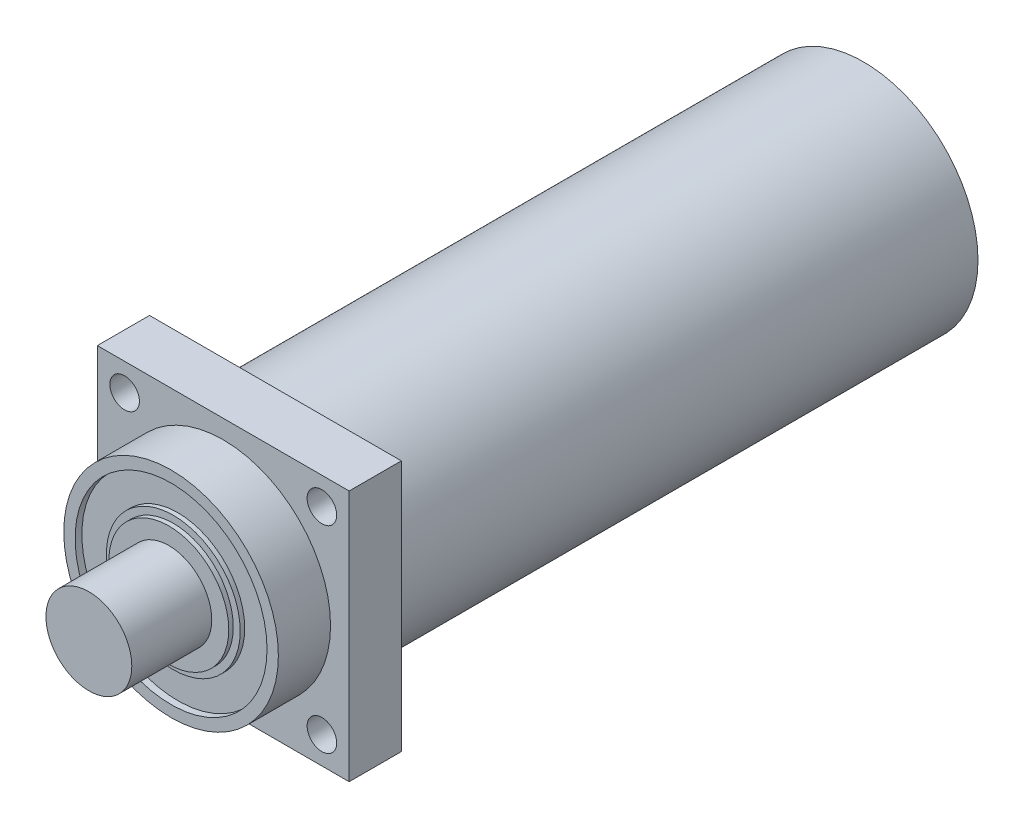
ISO-10303-21;
HEADER;
FILE_DESCRIPTION(('STEP AP214'),'2;1');
FILE_NAME('part.step','',(''),(''),'','','');
FILE_SCHEMA(('AUTOMOTIVE_DESIGN { 1 0 10303 214 1 1 1 1 }'));
ENDSEC;
DATA;
#1=APPLICATION_CONTEXT('core data for automotive mechanical design processes');
#2=APPLICATION_PROTOCOL_DEFINITION('international standard','automotive_design',2000,#1);
#3=PRODUCT_CONTEXT('',#1,'mechanical');
#4=PRODUCT('Part','Part','',(#3));
#5=PRODUCT_RELATED_PRODUCT_CATEGORY('part','',(#4));
#6=PRODUCT_DEFINITION_FORMATION('','',#4);
#7=PRODUCT_DEFINITION_CONTEXT('part definition',#1,'design');
#8=PRODUCT_DEFINITION('design','',#6,#7);
#9=PRODUCT_DEFINITION_SHAPE('','',#8);
#10=(LENGTH_UNIT() NAMED_UNIT(*) SI_UNIT(.MILLI.,.METRE.));
#11=(NAMED_UNIT(*) PLANE_ANGLE_UNIT() SI_UNIT($,.RADIAN.));
#12=(NAMED_UNIT(*) SI_UNIT($,.STERADIAN.) SOLID_ANGLE_UNIT());
#13=UNCERTAINTY_MEASURE_WITH_UNIT(LENGTH_MEASURE(1.E-05),#10,'distance_accuracy_value','');
#14=(GEOMETRIC_REPRESENTATION_CONTEXT(3) GLOBAL_UNCERTAINTY_ASSIGNED_CONTEXT((#13)) GLOBAL_UNIT_ASSIGNED_CONTEXT((#10,
#11,#12)) REPRESENTATION_CONTEXT('',''));
#15=CARTESIAN_POINT('',(0.,0.,0.));
#16=DIRECTION('',(0.,0.,1.));
#17=DIRECTION('',(1.,0.,0.));
#18=AXIS2_PLACEMENT_3D('',#15,#16,#17);
#19=CARTESIAN_POINT('',(-13.97,-13.97,5.79));
#20=DIRECTION('',(1.,0.,0.));
#21=DIRECTION('',(0.,0.,-1.));
#22=AXIS2_PLACEMENT_3D('',#19,#20,#21);
#23=PLANE('',#22);
#24=DIRECTION('',(0.,-1.,0.));
#25=VECTOR('',#24,1.);
#26=CARTESIAN_POINT('',(-13.97,-13.97,0.));
#27=LINE('',#26,#25);
#28=CARTESIAN_POINT('',(-13.97,13.97,0.));
#29=VERTEX_POINT('',#28);
#30=CARTESIAN_POINT('',(-13.97,-13.97,0.));
#31=VERTEX_POINT('',#30);
#32=EDGE_CURVE('E116',#29,#31,#27,.T.);
#33=ORIENTED_EDGE('',*,*,#32,.T.);
#34=DIRECTION('',(0.,0.,-1.));
#35=VECTOR('',#34,1.);
#36=CARTESIAN_POINT('',(-13.97,-13.97,5.79));
#37=LINE('',#36,#35);
#38=CARTESIAN_POINT('',(-13.97,-13.97,5.79));
#39=VERTEX_POINT('',#38);
#40=EDGE_CURVE('E105',#39,#31,#37,.T.);
#41=ORIENTED_EDGE('',*,*,#40,.F.);
#42=DIRECTION('',(0.,-1.,0.));
#43=VECTOR('',#42,1.);
#44=CARTESIAN_POINT('',(-13.97,-13.97,5.79));
#45=LINE('',#44,#43);
#46=CARTESIAN_POINT('',(-13.97,13.97,5.79));
#47=VERTEX_POINT('',#46);
#48=EDGE_CURVE('E97',#47,#39,#45,.T.);
#49=ORIENTED_EDGE('',*,*,#48,.F.);
#50=DIRECTION('',(0.,0.,-1.));
#51=VECTOR('',#50,1.);
#52=CARTESIAN_POINT('',(-13.97,13.97,5.79));
#53=LINE('',#52,#51);
#54=EDGE_CURVE('E112',#47,#29,#53,.T.);
#55=ORIENTED_EDGE('',*,*,#54,.T.);
#56=EDGE_LOOP('',(#33,#41,#49,#55));
#57=FACE_BOUND('',#56,.T.);
#58=ADVANCED_FACE('F42',(#57),#23,.F.);
#59=CARTESIAN_POINT('',(13.97,-13.97,5.79));
#60=DIRECTION('',(0.,1.,0.));
#61=DIRECTION('',(-1.,0.,0.));
#62=AXIS2_PLACEMENT_3D('',#59,#60,#61);
#63=PLANE('',#62);
#64=DIRECTION('',(1.,0.,0.));
#65=VECTOR('',#64,1.);
#66=CARTESIAN_POINT('',(13.97,-13.97,0.));
#67=LINE('',#66,#65);
#68=CARTESIAN_POINT('',(13.97,-13.97,0.));
#69=VERTEX_POINT('',#68);
#70=EDGE_CURVE('E103',#31,#69,#67,.T.);
#71=ORIENTED_EDGE('',*,*,#70,.T.);
#72=DIRECTION('',(0.,0.,-1.));
#73=VECTOR('',#72,1.);
#74=CARTESIAN_POINT('',(13.97,-13.97,5.79));
#75=LINE('',#74,#73);
#76=CARTESIAN_POINT('',(13.97,-13.97,5.79));
#77=VERTEX_POINT('',#76);
#78=EDGE_CURVE('E101',#77,#69,#75,.T.);
#79=ORIENTED_EDGE('',*,*,#78,.F.);
#80=DIRECTION('',(1.,0.,0.));
#81=VECTOR('',#80,1.);
#82=CARTESIAN_POINT('',(13.97,-13.97,5.79));
#83=LINE('',#82,#81);
#84=EDGE_CURVE('E92',#39,#77,#83,.T.);
#85=ORIENTED_EDGE('',*,*,#84,.F.);
#86=ORIENTED_EDGE('',*,*,#40,.T.);
#87=EDGE_LOOP('',(#71,#79,#85,#86));
#88=FACE_BOUND('',#87,.T.);
#89=ADVANCED_FACE('F102',(#88),#63,.F.);
#90=CARTESIAN_POINT('',(13.97,-13.97,5.79));
#91=DIRECTION('',(-1.,0.,0.));
#92=DIRECTION('',(0.,0.,1.));
#93=AXIS2_PLACEMENT_3D('',#90,#91,#92);
#94=PLANE('',#93);
#95=DIRECTION('',(0.,1.,0.));
#96=VECTOR('',#95,1.);
#97=CARTESIAN_POINT('',(13.97,-13.97,0.));
#98=LINE('',#97,#96);
#99=CARTESIAN_POINT('',(13.97,13.97,0.));
#100=VERTEX_POINT('',#99);
#101=EDGE_CURVE('E78',#69,#100,#98,.T.);
#102=ORIENTED_EDGE('',*,*,#101,.T.);
#103=DIRECTION('',(0.,0.,-1.));
#104=VECTOR('',#103,1.);
#105=CARTESIAN_POINT('',(13.97,13.97,5.79));
#106=LINE('',#105,#104);
#107=CARTESIAN_POINT('',(13.97,13.97,5.79));
#108=VERTEX_POINT('',#107);
#109=EDGE_CURVE('E106',#108,#100,#106,.T.);
#110=ORIENTED_EDGE('',*,*,#109,.F.);
#111=DIRECTION('',(0.,1.,0.));
#112=VECTOR('',#111,1.);
#113=CARTESIAN_POINT('',(13.97,-13.97,5.79));
#114=LINE('',#113,#112);
#115=EDGE_CURVE('E95',#77,#108,#114,.T.);
#116=ORIENTED_EDGE('',*,*,#115,.F.);
#117=ORIENTED_EDGE('',*,*,#78,.T.);
#118=EDGE_LOOP('',(#102,#110,#116,#117));
#119=FACE_BOUND('',#118,.T.);
#120=ADVANCED_FACE('F108',(#119),#94,.F.);
#121=CARTESIAN_POINT('',(13.97,13.97,5.79));
#122=DIRECTION('',(0.,-1.,0.));
#123=DIRECTION('',(1.,0.,0.));
#124=AXIS2_PLACEMENT_3D('',#121,#122,#123);
#125=PLANE('',#124);
#126=DIRECTION('',(-1.,0.,0.));
#127=VECTOR('',#126,1.);
#128=CARTESIAN_POINT('',(13.97,13.97,0.));
#129=LINE('',#128,#127);
#130=EDGE_CURVE('E84',#100,#29,#129,.T.);
#131=ORIENTED_EDGE('',*,*,#130,.T.);
#132=ORIENTED_EDGE('',*,*,#54,.F.);
#133=DIRECTION('',(-1.,0.,0.));
#134=VECTOR('',#133,1.);
#135=CARTESIAN_POINT('',(13.97,13.97,5.79));
#136=LINE('',#135,#134);
#137=EDGE_CURVE('E61',#108,#47,#136,.T.);
#138=ORIENTED_EDGE('',*,*,#137,.F.);
#139=ORIENTED_EDGE('',*,*,#109,.T.);
#140=EDGE_LOOP('',(#131,#132,#138,#139));
#141=FACE_BOUND('',#140,.T.);
#142=ADVANCED_FACE('F202',(#141),#125,.F.);
#143=CARTESIAN_POINT('',(0.,0.,5.79));
#144=DIRECTION('',(0.,0.,1.));
#145=DIRECTION('',(1.,0.,0.));
#146=AXIS2_PLACEMENT_3D('',#143,#144,#145);
#147=PLANE('',#146);
#148=CARTESIAN_POINT('',(-10.945,-10.945,5.79));
#149=DIRECTION('',(0.,0.,1.));
#150=DIRECTION('',(1.,0.,0.));
#151=AXIS2_PLACEMENT_3D('',#148,#149,#150);
#152=CIRCLE('',#151,1.64);
#153=CARTESIAN_POINT('',(-9.305,-10.945,5.79));
#154=VERTEX_POINT('',#153);
#155=EDGE_CURVE('E462',#154,#154,#152,.T.);
#156=ORIENTED_EDGE('',*,*,#155,.F.);
#157=EDGE_LOOP('',(#156));
#158=FACE_BOUND('',#157,.T.);
#159=CARTESIAN_POINT('',(10.945,-10.945,5.79));
#160=DIRECTION('',(0.,0.,1.));
#161=DIRECTION('',(1.,0.,0.));
#162=AXIS2_PLACEMENT_3D('',#159,#160,#161);
#163=CIRCLE('',#162,1.64);
#164=CARTESIAN_POINT('',(12.585,-10.945,5.79));
#165=VERTEX_POINT('',#164);
#166=EDGE_CURVE('E464',#165,#165,#163,.T.);
#167=ORIENTED_EDGE('',*,*,#166,.F.);
#168=EDGE_LOOP('',(#167));
#169=FACE_BOUND('',#168,.T.);
#170=CARTESIAN_POINT('',(10.945,10.945,5.79));
#171=DIRECTION('',(0.,0.,1.));
#172=DIRECTION('',(1.,0.,0.));
#173=AXIS2_PLACEMENT_3D('',#170,#171,#172);
#174=CIRCLE('',#173,1.64);
#175=CARTESIAN_POINT('',(12.585,10.945,5.79));
#176=VERTEX_POINT('',#175);
#177=EDGE_CURVE('E468',#176,#176,#174,.T.);
#178=ORIENTED_EDGE('',*,*,#177,.F.);
#179=EDGE_LOOP('',(#178));
#180=FACE_BOUND('',#179,.T.);
#181=CARTESIAN_POINT('',(-10.945,10.945,5.79));
#182=DIRECTION('',(0.,0.,1.));
#183=DIRECTION('',(1.,0.,0.));
#184=AXIS2_PLACEMENT_3D('',#181,#182,#183);
#185=CIRCLE('',#184,1.64);
#186=CARTESIAN_POINT('',(-9.305,10.945,5.79));
#187=VERTEX_POINT('',#186);
#188=EDGE_CURVE('E144',#187,#187,#185,.T.);
#189=ORIENTED_EDGE('',*,*,#188,.F.);
#190=EDGE_LOOP('',(#189));
#191=FACE_BOUND('',#190,.T.);
#192=CARTESIAN_POINT('',(0.,0.,5.79));
#193=DIRECTION('',(0.,0.,1.));
#194=DIRECTION('',(1.,0.,0.));
#195=AXIS2_PLACEMENT_3D('',#192,#193,#194);
#196=CIRCLE('',#195,11.905);
#197=CARTESIAN_POINT('',(11.905,0.,5.79));
#198=VERTEX_POINT('',#197);
#199=EDGE_CURVE('E52',#198,#198,#196,.T.);
#200=ORIENTED_EDGE('',*,*,#199,.F.);
#201=EDGE_LOOP('',(#200));
#202=FACE_BOUND('',#201,.T.);
#203=ORIENTED_EDGE('',*,*,#48,.T.);
#204=ORIENTED_EDGE('',*,*,#84,.T.);
#205=ORIENTED_EDGE('',*,*,#115,.T.);
#206=ORIENTED_EDGE('',*,*,#137,.T.);
#207=EDGE_LOOP('',(#203,#204,#205,#206));
#208=FACE_BOUND('',#207,.T.);
#209=ADVANCED_FACE('F93',(#158,#169,#180,#191,#202,#208),#147,.T.);
#210=CARTESIAN_POINT('',(0.,0.,0.));
#211=DIRECTION('',(0.,0.,1.));
#212=DIRECTION('',(1.,0.,0.));
#213=AXIS2_PLACEMENT_3D('',#210,#211,#212);
#214=PLANE('',#213);
#215=CARTESIAN_POINT('',(-10.945,-10.945,0.));
#216=DIRECTION('',(0.,0.,1.));
#217=DIRECTION('',(1.,0.,0.));
#218=AXIS2_PLACEMENT_3D('',#215,#216,#217);
#219=CIRCLE('',#218,1.64);
#220=CARTESIAN_POINT('',(-9.305,-10.945,0.));
#221=VERTEX_POINT('',#220);
#222=EDGE_CURVE('E45',#221,#221,#219,.T.);
#223=ORIENTED_EDGE('',*,*,#222,.T.);
#224=EDGE_LOOP('',(#223));
#225=FACE_BOUND('',#224,.T.);
#226=CARTESIAN_POINT('',(10.945,-10.945,0.));
#227=DIRECTION('',(0.,0.,1.));
#228=DIRECTION('',(1.,0.,0.));
#229=AXIS2_PLACEMENT_3D('',#226,#227,#228);
#230=CIRCLE('',#229,1.64);
#231=CARTESIAN_POINT('',(12.585,-10.945,0.));
#232=VERTEX_POINT('',#231);
#233=EDGE_CURVE('E147',#232,#232,#230,.T.);
#234=ORIENTED_EDGE('',*,*,#233,.T.);
#235=EDGE_LOOP('',(#234));
#236=FACE_BOUND('',#235,.T.);
#237=CARTESIAN_POINT('',(10.945,10.945,0.));
#238=DIRECTION('',(0.,0.,1.));
#239=DIRECTION('',(1.,0.,0.));
#240=AXIS2_PLACEMENT_3D('',#237,#238,#239);
#241=CIRCLE('',#240,1.64);
#242=CARTESIAN_POINT('',(12.585,10.945,0.));
#243=VERTEX_POINT('',#242);
#244=EDGE_CURVE('E143',#243,#243,#241,.T.);
#245=ORIENTED_EDGE('',*,*,#244,.T.);
#246=EDGE_LOOP('',(#245));
#247=FACE_BOUND('',#246,.T.);
#248=CARTESIAN_POINT('',(-10.945,10.945,0.));
#249=DIRECTION('',(0.,0.,1.));
#250=DIRECTION('',(1.,0.,0.));
#251=AXIS2_PLACEMENT_3D('',#248,#249,#250);
#252=CIRCLE('',#251,1.64);
#253=CARTESIAN_POINT('',(-9.305,10.945,0.));
#254=VERTEX_POINT('',#253);
#255=EDGE_CURVE('E139',#254,#254,#252,.T.);
#256=ORIENTED_EDGE('',*,*,#255,.T.);
#257=EDGE_LOOP('',(#256));
#258=FACE_BOUND('',#257,.T.);
#259=CARTESIAN_POINT('',(0.,0.,0.));
#260=DIRECTION('',(0.,0.,-1.));
#261=DIRECTION('',(-1.,0.,0.));
#262=AXIS2_PLACEMENT_3D('',#259,#260,#261);
#263=CIRCLE('',#262,12.7);
#264=CARTESIAN_POINT('',(-12.7,0.,0.));
#265=VERTEX_POINT('',#264);
#266=EDGE_CURVE('E11',#265,#265,#263,.T.);
#267=ORIENTED_EDGE('',*,*,#266,.F.);
#268=EDGE_LOOP('',(#267));
#269=FACE_BOUND('',#268,.T.);
#270=ORIENTED_EDGE('',*,*,#32,.F.);
#271=ORIENTED_EDGE('',*,*,#130,.F.);
#272=ORIENTED_EDGE('',*,*,#101,.F.);
#273=ORIENTED_EDGE('',*,*,#70,.F.);
#274=EDGE_LOOP('',(#270,#271,#272,#273));
#275=FACE_BOUND('',#274,.T.);
#276=ADVANCED_FACE('F201',(#225,#236,#247,#258,#269,#275),#214,.F.);
#277=CARTESIAN_POINT('',(0.,0.,11.58));
#278=DIRECTION('',(0.,0.,-1.));
#279=DIRECTION('',(-1.,0.,0.));
#280=AXIS2_PLACEMENT_3D('',#277,#278,#279);
#281=CYLINDRICAL_SURFACE('',#280,11.905);
#282=CARTESIAN_POINT('',(0.,0.,11.58));
#283=DIRECTION('',(0.,0.,1.));
#284=DIRECTION('',(1.,0.,0.));
#285=AXIS2_PLACEMENT_3D('',#282,#283,#284);
#286=CIRCLE('',#285,11.905);
#287=CARTESIAN_POINT('',(11.905,0.,11.58));
#288=VERTEX_POINT('',#287);
#289=EDGE_CURVE('E120',#288,#288,#286,.T.);
#290=ORIENTED_EDGE('',*,*,#289,.F.);
#291=EDGE_LOOP('',(#290));
#292=FACE_BOUND('',#291,.T.);
#293=ORIENTED_EDGE('',*,*,#199,.T.);
#294=EDGE_LOOP('',(#293));
#295=FACE_BOUND('',#294,.T.);
#296=ADVANCED_FACE('F198',(#292,#295),#281,.T.);
#297=CARTESIAN_POINT('',(0.,0.,11.58));
#298=DIRECTION('',(0.,0.,1.));
#299=DIRECTION('',(1.,0.,0.));
#300=AXIS2_PLACEMENT_3D('',#297,#298,#299);
#301=PLANE('',#300);
#302=CARTESIAN_POINT('',(0.,0.,11.58));
#303=DIRECTION('',(0.,0.,1.));
#304=DIRECTION('',(1.,0.,0.));
#305=AXIS2_PLACEMENT_3D('',#302,#303,#304);
#306=CIRCLE('',#305,10.6489316075053);
#307=CARTESIAN_POINT('',(10.6489316075053,0.,11.58));
#308=VERTEX_POINT('',#307);
#309=EDGE_CURVE('E171',#308,#308,#306,.T.);
#310=ORIENTED_EDGE('',*,*,#309,.F.);
#311=EDGE_LOOP('',(#310));
#312=FACE_BOUND('',#311,.T.);
#313=ORIENTED_EDGE('',*,*,#289,.T.);
#314=EDGE_LOOP('',(#313));
#315=FACE_BOUND('',#314,.T.);
#316=ADVANCED_FACE('F242',(#312,#315),#301,.T.);
#317=CARTESIAN_POINT('',(0.,0.,-65.25));
#318=DIRECTION('',(0.,0.,1.));
#319=DIRECTION('',(1.,0.,0.));
#320=AXIS2_PLACEMENT_3D('',#317,#318,#319);
#321=CYLINDRICAL_SURFACE('',#320,12.7);
#322=CARTESIAN_POINT('',(0.,0.,-65.25));
#323=DIRECTION('',(0.,0.,-1.));
#324=DIRECTION('',(-1.,0.,0.));
#325=AXIS2_PLACEMENT_3D('',#322,#323,#324);
#326=CIRCLE('',#325,12.7);
#327=CARTESIAN_POINT('',(-12.7,0.,-65.25));
#328=VERTEX_POINT('',#327);
#329=EDGE_CURVE('E179',#328,#328,#326,.T.);
#330=ORIENTED_EDGE('',*,*,#329,.F.);
#331=EDGE_LOOP('',(#330));
#332=FACE_BOUND('',#331,.T.);
#333=ORIENTED_EDGE('',*,*,#266,.T.);
#334=EDGE_LOOP('',(#333));
#335=FACE_BOUND('',#334,.T.);
#336=ADVANCED_FACE('F268',(#332,#335),#321,.T.);
#337=CARTESIAN_POINT('',(0.,0.,-65.25));
#338=DIRECTION('',(0.,0.,-1.));
#339=DIRECTION('',(-1.,0.,0.));
#340=AXIS2_PLACEMENT_3D('',#337,#338,#339);
#341=PLANE('',#340);
#342=ORIENTED_EDGE('',*,*,#329,.T.);
#343=EDGE_LOOP('',(#342));
#344=FACE_BOUND('',#343,.T.);
#345=ADVANCED_FACE('F272',(#344),#341,.T.);
#346=CARTESIAN_POINT('',(0.,0.,10.83));
#347=DIRECTION('',(0.,0.,1.));
#348=DIRECTION('',(1.,0.,0.));
#349=AXIS2_PLACEMENT_3D('',#346,#347,#348);
#350=CYLINDRICAL_SURFACE('',#349,10.6489316075053);
#351=CARTESIAN_POINT('',(0.,0.,10.83));
#352=DIRECTION('',(0.,0.,1.));
#353=DIRECTION('',(1.,0.,0.));
#354=AXIS2_PLACEMENT_3D('',#351,#352,#353);
#355=CIRCLE('',#354,10.6489316075053);
#356=CARTESIAN_POINT('',(10.6489316075053,0.,10.83));
#357=VERTEX_POINT('',#356);
#358=EDGE_CURVE('E175',#357,#357,#355,.T.);
#359=ORIENTED_EDGE('',*,*,#358,.F.);
#360=EDGE_LOOP('',(#359));
#361=FACE_BOUND('',#360,.T.);
#362=ORIENTED_EDGE('',*,*,#309,.T.);
#363=EDGE_LOOP('',(#362));
#364=FACE_BOUND('',#363,.T.);
#365=ADVANCED_FACE('F283',(#361,#364),#350,.F.);
#366=CARTESIAN_POINT('',(0.,0.,10.83));
#367=DIRECTION('',(0.,0.,1.));
#368=DIRECTION('',(1.,0.,0.));
#369=AXIS2_PLACEMENT_3D('',#366,#367,#368);
#370=PLANE('',#369);
#371=CARTESIAN_POINT('',(0.,0.,10.83));
#372=DIRECTION('',(0.,0.,1.));
#373=DIRECTION('',(1.,0.,0.));
#374=AXIS2_PLACEMENT_3D('',#371,#372,#373);
#375=CIRCLE('',#374,7.42095114404917);
#376=CARTESIAN_POINT('',(7.42095114404917,0.,10.83));
#377=VERTEX_POINT('',#376);
#378=EDGE_CURVE('E137',#377,#377,#375,.T.);
#379=ORIENTED_EDGE('',*,*,#378,.F.);
#380=EDGE_LOOP('',(#379));
#381=FACE_BOUND('',#380,.T.);
#382=ORIENTED_EDGE('',*,*,#358,.T.);
#383=EDGE_LOOP('',(#382));
#384=FACE_BOUND('',#383,.T.);
#385=ADVANCED_FACE('F302',(#381,#384),#370,.T.);
#386=CARTESIAN_POINT('',(0.,0.,11.33));
#387=DIRECTION('',(0.,0.,-1.));
#388=DIRECTION('',(-1.,0.,0.));
#389=AXIS2_PLACEMENT_3D('',#386,#387,#388);
#390=CYLINDRICAL_SURFACE('',#389,7.42095114404917);
#391=CARTESIAN_POINT('',(0.,0.,11.33));
#392=DIRECTION('',(0.,0.,1.));
#393=DIRECTION('',(1.,0.,0.));
#394=AXIS2_PLACEMENT_3D('',#391,#392,#393);
#395=CIRCLE('',#394,7.42095114404917);
#396=CARTESIAN_POINT('',(7.42095114404917,0.,11.33));
#397=VERTEX_POINT('',#396);
#398=EDGE_CURVE('E167',#397,#397,#395,.T.);
#399=ORIENTED_EDGE('',*,*,#398,.F.);
#400=EDGE_LOOP('',(#399));
#401=FACE_BOUND('',#400,.T.);
#402=ORIENTED_EDGE('',*,*,#378,.T.);
#403=EDGE_LOOP('',(#402));
#404=FACE_BOUND('',#403,.T.);
#405=ADVANCED_FACE('F313',(#401,#404),#390,.T.);
#406=CARTESIAN_POINT('',(0.,0.,11.33));
#407=DIRECTION('',(0.,0.,1.));
#408=DIRECTION('',(1.,0.,0.));
#409=AXIS2_PLACEMENT_3D('',#406,#407,#408);
#410=PLANE('',#409);
#411=CARTESIAN_POINT('',(0.,0.,11.33));
#412=DIRECTION('',(0.,0.,1.));
#413=DIRECTION('',(1.,0.,0.));
#414=AXIS2_PLACEMENT_3D('',#411,#412,#413);
#415=CIRCLE('',#414,6.65127886510938);
#416=CARTESIAN_POINT('',(6.65127886510938,0.,11.33));
#417=VERTEX_POINT('',#416);
#418=EDGE_CURVE('E154',#417,#417,#415,.T.);
#419=ORIENTED_EDGE('',*,*,#418,.F.);
#420=EDGE_LOOP('',(#419));
#421=FACE_BOUND('',#420,.T.);
#422=ORIENTED_EDGE('',*,*,#398,.T.);
#423=EDGE_LOOP('',(#422));
#424=FACE_BOUND('',#423,.T.);
#425=ADVANCED_FACE('F325',(#421,#424),#410,.T.);
#426=CARTESIAN_POINT('',(0.,0.,11.83));
#427=DIRECTION('',(0.,0.,-1.));
#428=DIRECTION('',(-1.,0.,0.));
#429=AXIS2_PLACEMENT_3D('',#426,#427,#428);
#430=CYLINDRICAL_SURFACE('',#429,6.65127886510938);
#431=CARTESIAN_POINT('',(0.,0.,11.83));
#432=DIRECTION('',(0.,0.,1.));
#433=DIRECTION('',(1.,0.,0.));
#434=AXIS2_PLACEMENT_3D('',#431,#432,#433);
#435=CIRCLE('',#434,6.65127886510938);
#436=CARTESIAN_POINT('',(6.65127886510938,0.,11.83));
#437=VERTEX_POINT('',#436);
#438=EDGE_CURVE('E138',#437,#437,#435,.T.);
#439=ORIENTED_EDGE('',*,*,#438,.F.);
#440=EDGE_LOOP('',(#439));
#441=FACE_BOUND('',#440,.T.);
#442=ORIENTED_EDGE('',*,*,#418,.T.);
#443=EDGE_LOOP('',(#442));
#444=FACE_BOUND('',#443,.T.);
#445=ADVANCED_FACE('F336',(#441,#444),#430,.T.);
#446=CARTESIAN_POINT('',(0.,0.,11.83));
#447=DIRECTION('',(0.,0.,1.));
#448=DIRECTION('',(1.,0.,0.));
#449=AXIS2_PLACEMENT_3D('',#446,#447,#448);
#450=PLANE('',#449);
#451=CARTESIAN_POINT('',(0.,0.,11.83));
#452=DIRECTION('',(0.,0.,1.));
#453=DIRECTION('',(1.,0.,0.));
#454=AXIS2_PLACEMENT_3D('',#451,#452,#453);
#455=CIRCLE('',#454,4.765);
#456=CARTESIAN_POINT('',(4.765,0.,11.83));
#457=VERTEX_POINT('',#456);
#458=EDGE_CURVE('E133',#457,#457,#455,.T.);
#459=ORIENTED_EDGE('',*,*,#458,.F.);
#460=EDGE_LOOP('',(#459));
#461=FACE_BOUND('',#460,.T.);
#462=ORIENTED_EDGE('',*,*,#438,.T.);
#463=EDGE_LOOP('',(#462));
#464=FACE_BOUND('',#463,.T.);
#465=ADVANCED_FACE('F257',(#461,#464),#450,.T.);
#466=CARTESIAN_POINT('',(0.,0.,20.7));
#467=DIRECTION('',(0.,0.,1.));
#468=DIRECTION('',(1.,0.,0.));
#469=AXIS2_PLACEMENT_3D('',#466,#467,#468);
#470=PLANE('',#469);
#471=CARTESIAN_POINT('',(0.,0.,20.7));
#472=DIRECTION('',(0.,0.,1.));
#473=DIRECTION('',(1.,0.,0.));
#474=AXIS2_PLACEMENT_3D('',#471,#472,#473);
#475=CIRCLE('',#474,4.765);
#476=CARTESIAN_POINT('',(4.765,0.,20.7));
#477=VERTEX_POINT('',#476);
#478=EDGE_CURVE('E185',#477,#477,#475,.T.);
#479=ORIENTED_EDGE('',*,*,#478,.T.);
#480=EDGE_LOOP('',(#479));
#481=FACE_BOUND('',#480,.T.);
#482=ADVANCED_FACE('F251',(#481),#470,.T.);
#483=CARTESIAN_POINT('',(0.,0.,20.7));
#484=DIRECTION('',(0.,0.,-1.));
#485=DIRECTION('',(-1.,0.,0.));
#486=AXIS2_PLACEMENT_3D('',#483,#484,#485);
#487=CYLINDRICAL_SURFACE('',#486,4.765);
#488=ORIENTED_EDGE('',*,*,#458,.T.);
#489=EDGE_LOOP('',(#488));
#490=FACE_BOUND('',#489,.T.);
#491=ORIENTED_EDGE('',*,*,#478,.F.);
#492=EDGE_LOOP('',(#491));
#493=FACE_BOUND('',#492,.T.);
#494=ADVANCED_FACE('F256',(#490,#493),#487,.T.);
#495=CARTESIAN_POINT('',(-10.945,10.945,-4.71));
#496=DIRECTION('',(0.,0.,1.));
#497=DIRECTION('',(1.,0.,0.));
#498=AXIS2_PLACEMENT_3D('',#495,#496,#497);
#499=CYLINDRICAL_SURFACE('',#498,1.64);
#500=CARTESIAN_POINT('',(-9.305,10.945,5.79));
#501=CARTESIAN_POINT('',(-9.305,10.945,5.7296875));
#502=CARTESIAN_POINT('',(-9.305,10.945,5.669375));
#503=CARTESIAN_POINT('',(-9.305,10.945,5.54875));
#504=CARTESIAN_POINT('',(-9.305,10.945,5.4884375));
#505=CARTESIAN_POINT('',(-9.305,10.945,5.3678125));
#506=CARTESIAN_POINT('',(-9.305,10.945,5.3075));
#507=CARTESIAN_POINT('',(-9.305,10.945,5.186875));
#508=CARTESIAN_POINT('',(-9.305,10.945,5.1265625));
#509=CARTESIAN_POINT('',(-9.305,10.945,5.0059375));
#510=CARTESIAN_POINT('',(-9.305,10.945,4.945625));
#511=CARTESIAN_POINT('',(-9.305,10.945,4.825));
#512=CARTESIAN_POINT('',(-9.305,10.945,4.7646875));
#513=CARTESIAN_POINT('',(-9.305,10.945,4.6440625));
#514=CARTESIAN_POINT('',(-9.305,10.945,4.58375));
#515=CARTESIAN_POINT('',(-9.305,10.945,4.463125));
#516=CARTESIAN_POINT('',(-9.305,10.945,4.4028125));
#517=CARTESIAN_POINT('',(-9.305,10.945,4.2821875));
#518=CARTESIAN_POINT('',(-9.305,10.945,4.221875));
#519=CARTESIAN_POINT('',(-9.305,10.945,4.10125));
#520=CARTESIAN_POINT('',(-9.305,10.945,4.0409375));
#521=CARTESIAN_POINT('',(-9.305,10.945,3.9203125));
#522=CARTESIAN_POINT('',(-9.305,10.945,3.86));
#523=CARTESIAN_POINT('',(-9.305,10.945,3.739375));
#524=CARTESIAN_POINT('',(-9.305,10.945,3.6790625));
#525=CARTESIAN_POINT('',(-9.305,10.945,3.5584375));
#526=CARTESIAN_POINT('',(-9.305,10.945,3.498125));
#527=CARTESIAN_POINT('',(-9.305,10.945,3.3775));
#528=CARTESIAN_POINT('',(-9.305,10.945,3.3171875));
#529=CARTESIAN_POINT('',(-9.305,10.945,3.1965625));
#530=CARTESIAN_POINT('',(-9.305,10.945,3.13625));
#531=CARTESIAN_POINT('',(-9.305,10.945,3.015625));
#532=CARTESIAN_POINT('',(-9.305,10.945,2.9553125));
#533=CARTESIAN_POINT('',(-9.305,10.945,2.8346875));
#534=CARTESIAN_POINT('',(-9.305,10.945,2.774375));
#535=CARTESIAN_POINT('',(-9.305,10.945,2.65375));
#536=CARTESIAN_POINT('',(-9.305,10.945,2.5934375));
#537=CARTESIAN_POINT('',(-9.305,10.945,2.4728125));
#538=CARTESIAN_POINT('',(-9.305,10.945,2.4125));
#539=CARTESIAN_POINT('',(-9.305,10.945,2.291875));
#540=CARTESIAN_POINT('',(-9.305,10.945,2.2315625));
#541=CARTESIAN_POINT('',(-9.305,10.945,2.1109375));
#542=CARTESIAN_POINT('',(-9.305,10.945,2.050625));
#543=CARTESIAN_POINT('',(-9.305,10.945,1.93));
#544=CARTESIAN_POINT('',(-9.305,10.945,1.8696875));
#545=CARTESIAN_POINT('',(-9.305,10.945,1.7490625));
#546=CARTESIAN_POINT('',(-9.305,10.945,1.68875));
#547=CARTESIAN_POINT('',(-9.305,10.945,1.568125));
#548=CARTESIAN_POINT('',(-9.305,10.945,1.5078125));
#549=CARTESIAN_POINT('',(-9.305,10.945,1.3871875));
#550=CARTESIAN_POINT('',(-9.305,10.945,1.326875));
#551=CARTESIAN_POINT('',(-9.305,10.945,1.20625));
#552=CARTESIAN_POINT('',(-9.305,10.945,1.1459375));
#553=CARTESIAN_POINT('',(-9.305,10.945,1.0253125));
#554=CARTESIAN_POINT('',(-9.305,10.945,0.964999999999999));
#555=CARTESIAN_POINT('',(-9.305,10.945,0.844374999999999));
#556=CARTESIAN_POINT('',(-9.305,10.945,0.784062499999999));
#557=CARTESIAN_POINT('',(-9.305,10.945,0.663437499999999));
#558=CARTESIAN_POINT('',(-9.305,10.945,0.603124999999999));
#559=CARTESIAN_POINT('',(-9.305,10.945,0.482499999999999));
#560=CARTESIAN_POINT('',(-9.305,10.945,0.422187499999999));
#561=CARTESIAN_POINT('',(-9.305,10.945,0.301562499999999));
#562=CARTESIAN_POINT('',(-9.305,10.945,0.241249999999999));
#563=CARTESIAN_POINT('',(-9.305,10.945,0.120624999999999));
#564=CARTESIAN_POINT('',(-9.305,10.945,0.060312499999999));
#565=CARTESIAN_POINT('',(-9.305,10.945,0.));
#566=B_SPLINE_CURVE_WITH_KNOTS('',3,(#500,#501,#502,#503,#504,#505,#506,#507,#508,#509,#510,
#511,#512,#513,#514,#515,#516,#517,#518,#519,#520,#521,#522,#523,#524,#525,#526,#527,#528,#529,
#530,#531,#532,#533,#534,#535,#536,#537,#538,#539,#540,#541,#542,#543,#544,#545,#546,#547,#548,
#549,#550,#551,#552,#553,#554,#555,#556,#557,#558,#559,#560,#561,#562,#563,#564,#565),
.UNSPECIFIED.,.F.,.F.,(4,2,2,2,2,2,2,2,2,2,2,2,2,2,2,2,2,2,2,2,2,2,2,2,2,2,2,2,2,2,2,2,4),(0.,
0.180937500000001,0.361874999999999,0.5428125,0.72375,0.904687500000001,1.085625,1.2665625,
1.4475,1.6284375,1.809375,1.9903125,2.17125,2.3521875,2.533125,2.7140625,2.895,3.0759375,
3.256875,3.4378125,3.61875,3.7996875,3.980625,4.1615625,4.3425,4.5234375,4.704375,4.8853125,
5.06625,5.2471875,5.428125,5.6090625,5.79),.UNSPECIFIED.);
#567=EDGE_CURVE('BSEAM364',#187,#254,#566,.T.);
#568=ORIENTED_EDGE('',*,*,#188,.T.);
#569=ORIENTED_EDGE('',*,*,#255,.F.);
#570=ORIENTED_EDGE('',*,*,#567,.T.);
#571=ORIENTED_EDGE('',*,*,#567,.F.);
#572=EDGE_LOOP('',(#568,#570,#569,#571));
#573=FACE_BOUND('',#572,.T.);
#574=ADVANCED_FACE('F364',(#573),#499,.F.);
#575=CARTESIAN_POINT('',(10.945,10.945,-4.71));
#576=DIRECTION('',(0.,0.,1.));
#577=DIRECTION('',(1.,0.,0.));
#578=AXIS2_PLACEMENT_3D('',#575,#576,#577);
#579=CYLINDRICAL_SURFACE('',#578,1.64);
#580=CARTESIAN_POINT('',(12.585,10.945,5.79));
#581=CARTESIAN_POINT('',(12.585,10.945,5.7296875));
#582=CARTESIAN_POINT('',(12.585,10.945,5.669375));
#583=CARTESIAN_POINT('',(12.585,10.945,5.54875));
#584=CARTESIAN_POINT('',(12.585,10.945,5.4884375));
#585=CARTESIAN_POINT('',(12.585,10.945,5.3678125));
#586=CARTESIAN_POINT('',(12.585,10.945,5.3075));
#587=CARTESIAN_POINT('',(12.585,10.945,5.186875));
#588=CARTESIAN_POINT('',(12.585,10.945,5.1265625));
#589=CARTESIAN_POINT('',(12.585,10.945,5.0059375));
#590=CARTESIAN_POINT('',(12.585,10.945,4.945625));
#591=CARTESIAN_POINT('',(12.585,10.945,4.825));
#592=CARTESIAN_POINT('',(12.585,10.945,4.7646875));
#593=CARTESIAN_POINT('',(12.585,10.945,4.6440625));
#594=CARTESIAN_POINT('',(12.585,10.945,4.58375));
#595=CARTESIAN_POINT('',(12.585,10.945,4.463125));
#596=CARTESIAN_POINT('',(12.585,10.945,4.4028125));
#597=CARTESIAN_POINT('',(12.585,10.945,4.2821875));
#598=CARTESIAN_POINT('',(12.585,10.945,4.221875));
#599=CARTESIAN_POINT('',(12.585,10.945,4.10125));
#600=CARTESIAN_POINT('',(12.585,10.945,4.0409375));
#601=CARTESIAN_POINT('',(12.585,10.945,3.9203125));
#602=CARTESIAN_POINT('',(12.585,10.945,3.86));
#603=CARTESIAN_POINT('',(12.585,10.945,3.739375));
#604=CARTESIAN_POINT('',(12.585,10.945,3.6790625));
#605=CARTESIAN_POINT('',(12.585,10.945,3.5584375));
#606=CARTESIAN_POINT('',(12.585,10.945,3.498125));
#607=CARTESIAN_POINT('',(12.585,10.945,3.3775));
#608=CARTESIAN_POINT('',(12.585,10.945,3.3171875));
#609=CARTESIAN_POINT('',(12.585,10.945,3.1965625));
#610=CARTESIAN_POINT('',(12.585,10.945,3.13625));
#611=CARTESIAN_POINT('',(12.585,10.945,3.015625));
#612=CARTESIAN_POINT('',(12.585,10.945,2.9553125));
#613=CARTESIAN_POINT('',(12.585,10.945,2.8346875));
#614=CARTESIAN_POINT('',(12.585,10.945,2.774375));
#615=CARTESIAN_POINT('',(12.585,10.945,2.65375));
#616=CARTESIAN_POINT('',(12.585,10.945,2.5934375));
#617=CARTESIAN_POINT('',(12.585,10.945,2.4728125));
#618=CARTESIAN_POINT('',(12.585,10.945,2.4125));
#619=CARTESIAN_POINT('',(12.585,10.945,2.291875));
#620=CARTESIAN_POINT('',(12.585,10.945,2.2315625));
#621=CARTESIAN_POINT('',(12.585,10.945,2.1109375));
#622=CARTESIAN_POINT('',(12.585,10.945,2.050625));
#623=CARTESIAN_POINT('',(12.585,10.945,1.93));
#624=CARTESIAN_POINT('',(12.585,10.945,1.8696875));
#625=CARTESIAN_POINT('',(12.585,10.945,1.7490625));
#626=CARTESIAN_POINT('',(12.585,10.945,1.68875));
#627=CARTESIAN_POINT('',(12.585,10.945,1.568125));
#628=CARTESIAN_POINT('',(12.585,10.945,1.5078125));
#629=CARTESIAN_POINT('',(12.585,10.945,1.3871875));
#630=CARTESIAN_POINT('',(12.585,10.945,1.326875));
#631=CARTESIAN_POINT('',(12.585,10.945,1.20625));
#632=CARTESIAN_POINT('',(12.585,10.945,1.1459375));
#633=CARTESIAN_POINT('',(12.585,10.945,1.0253125));
#634=CARTESIAN_POINT('',(12.585,10.945,0.964999999999999));
#635=CARTESIAN_POINT('',(12.585,10.945,0.844374999999999));
#636=CARTESIAN_POINT('',(12.585,10.945,0.784062499999999));
#637=CARTESIAN_POINT('',(12.585,10.945,0.663437499999999));
#638=CARTESIAN_POINT('',(12.585,10.945,0.603124999999999));
#639=CARTESIAN_POINT('',(12.585,10.945,0.482499999999999));
#640=CARTESIAN_POINT('',(12.585,10.945,0.422187499999999));
#641=CARTESIAN_POINT('',(12.585,10.945,0.301562499999999));
#642=CARTESIAN_POINT('',(12.585,10.945,0.241249999999999));
#643=CARTESIAN_POINT('',(12.585,10.945,0.120624999999999));
#644=CARTESIAN_POINT('',(12.585,10.945,0.060312499999999));
#645=CARTESIAN_POINT('',(12.585,10.945,0.));
#646=B_SPLINE_CURVE_WITH_KNOTS('',3,(#580,#581,#582,#583,#584,#585,#586,#587,#588,#589,#590,
#591,#592,#593,#594,#595,#596,#597,#598,#599,#600,#601,#602,#603,#604,#605,#606,#607,#608,#609,
#610,#611,#612,#613,#614,#615,#616,#617,#618,#619,#620,#621,#622,#623,#624,#625,#626,#627,#628,
#629,#630,#631,#632,#633,#634,#635,#636,#637,#638,#639,#640,#641,#642,#643,#644,#645),
.UNSPECIFIED.,.F.,.F.,(4,2,2,2,2,2,2,2,2,2,2,2,2,2,2,2,2,2,2,2,2,2,2,2,2,2,2,2,2,2,2,2,4),(0.,
0.180937500000001,0.361874999999999,0.5428125,0.72375,0.904687500000001,1.085625,1.2665625,
1.4475,1.6284375,1.809375,1.9903125,2.17125,2.3521875,2.533125,2.7140625,2.895,3.0759375,
3.256875,3.4378125,3.61875,3.7996875,3.980625,4.1615625,4.3425,4.5234375,4.704375,4.8853125,
5.06625,5.2471875,5.428125,5.6090625,5.79),.UNSPECIFIED.);
#647=EDGE_CURVE('BSEAM384',#176,#243,#646,.T.);
#648=ORIENTED_EDGE('',*,*,#177,.T.);
#649=ORIENTED_EDGE('',*,*,#244,.F.);
#650=ORIENTED_EDGE('',*,*,#647,.T.);
#651=ORIENTED_EDGE('',*,*,#647,.F.);
#652=EDGE_LOOP('',(#648,#650,#649,#651));
#653=FACE_BOUND('',#652,.T.);
#654=ADVANCED_FACE('F384',(#653),#579,.F.);
#655=CARTESIAN_POINT('',(10.945,-10.945,-4.71));
#656=DIRECTION('',(0.,0.,1.));
#657=DIRECTION('',(1.,0.,0.));
#658=AXIS2_PLACEMENT_3D('',#655,#656,#657);
#659=CYLINDRICAL_SURFACE('',#658,1.64);
#660=CARTESIAN_POINT('',(12.585,-10.945,5.79));
#661=CARTESIAN_POINT('',(12.585,-10.945,5.7296875));
#662=CARTESIAN_POINT('',(12.585,-10.945,5.669375));
#663=CARTESIAN_POINT('',(12.585,-10.945,5.54875));
#664=CARTESIAN_POINT('',(12.585,-10.945,5.4884375));
#665=CARTESIAN_POINT('',(12.585,-10.945,5.3678125));
#666=CARTESIAN_POINT('',(12.585,-10.945,5.3075));
#667=CARTESIAN_POINT('',(12.585,-10.945,5.186875));
#668=CARTESIAN_POINT('',(12.585,-10.945,5.1265625));
#669=CARTESIAN_POINT('',(12.585,-10.945,5.0059375));
#670=CARTESIAN_POINT('',(12.585,-10.945,4.945625));
#671=CARTESIAN_POINT('',(12.585,-10.945,4.825));
#672=CARTESIAN_POINT('',(12.585,-10.945,4.7646875));
#673=CARTESIAN_POINT('',(12.585,-10.945,4.6440625));
#674=CARTESIAN_POINT('',(12.585,-10.945,4.58375));
#675=CARTESIAN_POINT('',(12.585,-10.945,4.463125));
#676=CARTESIAN_POINT('',(12.585,-10.945,4.4028125));
#677=CARTESIAN_POINT('',(12.585,-10.945,4.2821875));
#678=CARTESIAN_POINT('',(12.585,-10.945,4.221875));
#679=CARTESIAN_POINT('',(12.585,-10.945,4.10125));
#680=CARTESIAN_POINT('',(12.585,-10.945,4.0409375));
#681=CARTESIAN_POINT('',(12.585,-10.945,3.9203125));
#682=CARTESIAN_POINT('',(12.585,-10.945,3.86));
#683=CARTESIAN_POINT('',(12.585,-10.945,3.739375));
#684=CARTESIAN_POINT('',(12.585,-10.945,3.6790625));
#685=CARTESIAN_POINT('',(12.585,-10.945,3.5584375));
#686=CARTESIAN_POINT('',(12.585,-10.945,3.498125));
#687=CARTESIAN_POINT('',(12.585,-10.945,3.3775));
#688=CARTESIAN_POINT('',(12.585,-10.945,3.3171875));
#689=CARTESIAN_POINT('',(12.585,-10.945,3.1965625));
#690=CARTESIAN_POINT('',(12.585,-10.945,3.13625));
#691=CARTESIAN_POINT('',(12.585,-10.945,3.015625));
#692=CARTESIAN_POINT('',(12.585,-10.945,2.9553125));
#693=CARTESIAN_POINT('',(12.585,-10.945,2.8346875));
#694=CARTESIAN_POINT('',(12.585,-10.945,2.774375));
#695=CARTESIAN_POINT('',(12.585,-10.945,2.65375));
#696=CARTESIAN_POINT('',(12.585,-10.945,2.5934375));
#697=CARTESIAN_POINT('',(12.585,-10.945,2.4728125));
#698=CARTESIAN_POINT('',(12.585,-10.945,2.4125));
#699=CARTESIAN_POINT('',(12.585,-10.945,2.291875));
#700=CARTESIAN_POINT('',(12.585,-10.945,2.2315625));
#701=CARTESIAN_POINT('',(12.585,-10.945,2.1109375));
#702=CARTESIAN_POINT('',(12.585,-10.945,2.050625));
#703=CARTESIAN_POINT('',(12.585,-10.945,1.93));
#704=CARTESIAN_POINT('',(12.585,-10.945,1.8696875));
#705=CARTESIAN_POINT('',(12.585,-10.945,1.7490625));
#706=CARTESIAN_POINT('',(12.585,-10.945,1.68875));
#707=CARTESIAN_POINT('',(12.585,-10.945,1.568125));
#708=CARTESIAN_POINT('',(12.585,-10.945,1.5078125));
#709=CARTESIAN_POINT('',(12.585,-10.945,1.3871875));
#710=CARTESIAN_POINT('',(12.585,-10.945,1.326875));
#711=CARTESIAN_POINT('',(12.585,-10.945,1.20625));
#712=CARTESIAN_POINT('',(12.585,-10.945,1.1459375));
#713=CARTESIAN_POINT('',(12.585,-10.945,1.0253125));
#714=CARTESIAN_POINT('',(12.585,-10.945,0.964999999999999));
#715=CARTESIAN_POINT('',(12.585,-10.945,0.844374999999999));
#716=CARTESIAN_POINT('',(12.585,-10.945,0.784062499999999));
#717=CARTESIAN_POINT('',(12.585,-10.945,0.663437499999999));
#718=CARTESIAN_POINT('',(12.585,-10.945,0.603124999999999));
#719=CARTESIAN_POINT('',(12.585,-10.945,0.482499999999999));
#720=CARTESIAN_POINT('',(12.585,-10.945,0.422187499999999));
#721=CARTESIAN_POINT('',(12.585,-10.945,0.301562499999999));
#722=CARTESIAN_POINT('',(12.585,-10.945,0.241249999999999));
#723=CARTESIAN_POINT('',(12.585,-10.945,0.120624999999999));
#724=CARTESIAN_POINT('',(12.585,-10.945,0.060312499999999));
#725=CARTESIAN_POINT('',(12.585,-10.945,0.));
#726=B_SPLINE_CURVE_WITH_KNOTS('',3,(#660,#661,#662,#663,#664,#665,#666,#667,#668,#669,#670,
#671,#672,#673,#674,#675,#676,#677,#678,#679,#680,#681,#682,#683,#684,#685,#686,#687,#688,#689,
#690,#691,#692,#693,#694,#695,#696,#697,#698,#699,#700,#701,#702,#703,#704,#705,#706,#707,#708,
#709,#710,#711,#712,#713,#714,#715,#716,#717,#718,#719,#720,#721,#722,#723,#724,#725),
.UNSPECIFIED.,.F.,.F.,(4,2,2,2,2,2,2,2,2,2,2,2,2,2,2,2,2,2,2,2,2,2,2,2,2,2,2,2,2,2,2,2,4),(0.,
0.180937500000001,0.361874999999999,0.5428125,0.72375,0.904687500000001,1.085625,1.2665625,
1.4475,1.6284375,1.809375,1.9903125,2.17125,2.3521875,2.533125,2.7140625,2.895,3.0759375,
3.256875,3.4378125,3.61875,3.7996875,3.980625,4.1615625,4.3425,4.5234375,4.704375,4.8853125,
5.06625,5.2471875,5.428125,5.6090625,5.79),.UNSPECIFIED.);
#727=EDGE_CURVE('BSEAM395',#165,#232,#726,.T.);
#728=ORIENTED_EDGE('',*,*,#166,.T.);
#729=ORIENTED_EDGE('',*,*,#233,.F.);
#730=ORIENTED_EDGE('',*,*,#727,.T.);
#731=ORIENTED_EDGE('',*,*,#727,.F.);
#732=EDGE_LOOP('',(#728,#730,#729,#731));
#733=FACE_BOUND('',#732,.T.);
#734=ADVANCED_FACE('F395',(#733),#659,.F.);
#735=CARTESIAN_POINT('',(-10.945,-10.945,-4.71));
#736=DIRECTION('',(0.,0.,1.));
#737=DIRECTION('',(1.,0.,0.));
#738=AXIS2_PLACEMENT_3D('',#735,#736,#737);
#739=CYLINDRICAL_SURFACE('',#738,1.64);
#740=CARTESIAN_POINT('',(-9.305,-10.945,5.79));
#741=CARTESIAN_POINT('',(-9.305,-10.945,5.7296875));
#742=CARTESIAN_POINT('',(-9.305,-10.945,5.669375));
#743=CARTESIAN_POINT('',(-9.305,-10.945,5.54875));
#744=CARTESIAN_POINT('',(-9.305,-10.945,5.4884375));
#745=CARTESIAN_POINT('',(-9.305,-10.945,5.3678125));
#746=CARTESIAN_POINT('',(-9.305,-10.945,5.3075));
#747=CARTESIAN_POINT('',(-9.305,-10.945,5.186875));
#748=CARTESIAN_POINT('',(-9.305,-10.945,5.1265625));
#749=CARTESIAN_POINT('',(-9.305,-10.945,5.0059375));
#750=CARTESIAN_POINT('',(-9.305,-10.945,4.945625));
#751=CARTESIAN_POINT('',(-9.305,-10.945,4.825));
#752=CARTESIAN_POINT('',(-9.305,-10.945,4.7646875));
#753=CARTESIAN_POINT('',(-9.305,-10.945,4.6440625));
#754=CARTESIAN_POINT('',(-9.305,-10.945,4.58375));
#755=CARTESIAN_POINT('',(-9.305,-10.945,4.463125));
#756=CARTESIAN_POINT('',(-9.305,-10.945,4.4028125));
#757=CARTESIAN_POINT('',(-9.305,-10.945,4.2821875));
#758=CARTESIAN_POINT('',(-9.305,-10.945,4.221875));
#759=CARTESIAN_POINT('',(-9.305,-10.945,4.10125));
#760=CARTESIAN_POINT('',(-9.305,-10.945,4.0409375));
#761=CARTESIAN_POINT('',(-9.305,-10.945,3.9203125));
#762=CARTESIAN_POINT('',(-9.305,-10.945,3.86));
#763=CARTESIAN_POINT('',(-9.305,-10.945,3.739375));
#764=CARTESIAN_POINT('',(-9.305,-10.945,3.6790625));
#765=CARTESIAN_POINT('',(-9.305,-10.945,3.5584375));
#766=CARTESIAN_POINT('',(-9.305,-10.945,3.498125));
#767=CARTESIAN_POINT('',(-9.305,-10.945,3.3775));
#768=CARTESIAN_POINT('',(-9.305,-10.945,3.3171875));
#769=CARTESIAN_POINT('',(-9.305,-10.945,3.1965625));
#770=CARTESIAN_POINT('',(-9.305,-10.945,3.13625));
#771=CARTESIAN_POINT('',(-9.305,-10.945,3.015625));
#772=CARTESIAN_POINT('',(-9.305,-10.945,2.9553125));
#773=CARTESIAN_POINT('',(-9.305,-10.945,2.8346875));
#774=CARTESIAN_POINT('',(-9.305,-10.945,2.774375));
#775=CARTESIAN_POINT('',(-9.305,-10.945,2.65375));
#776=CARTESIAN_POINT('',(-9.305,-10.945,2.5934375));
#777=CARTESIAN_POINT('',(-9.305,-10.945,2.4728125));
#778=CARTESIAN_POINT('',(-9.305,-10.945,2.4125));
#779=CARTESIAN_POINT('',(-9.305,-10.945,2.291875));
#780=CARTESIAN_POINT('',(-9.305,-10.945,2.2315625));
#781=CARTESIAN_POINT('',(-9.305,-10.945,2.1109375));
#782=CARTESIAN_POINT('',(-9.305,-10.945,2.050625));
#783=CARTESIAN_POINT('',(-9.305,-10.945,1.93));
#784=CARTESIAN_POINT('',(-9.305,-10.945,1.8696875));
#785=CARTESIAN_POINT('',(-9.305,-10.945,1.7490625));
#786=CARTESIAN_POINT('',(-9.305,-10.945,1.68875));
#787=CARTESIAN_POINT('',(-9.305,-10.945,1.568125));
#788=CARTESIAN_POINT('',(-9.305,-10.945,1.5078125));
#789=CARTESIAN_POINT('',(-9.305,-10.945,1.3871875));
#790=CARTESIAN_POINT('',(-9.305,-10.945,1.326875));
#791=CARTESIAN_POINT('',(-9.305,-10.945,1.20625));
#792=CARTESIAN_POINT('',(-9.305,-10.945,1.1459375));
#793=CARTESIAN_POINT('',(-9.305,-10.945,1.0253125));
#794=CARTESIAN_POINT('',(-9.305,-10.945,0.964999999999999));
#795=CARTESIAN_POINT('',(-9.305,-10.945,0.844374999999999));
#796=CARTESIAN_POINT('',(-9.305,-10.945,0.784062499999999));
#797=CARTESIAN_POINT('',(-9.305,-10.945,0.663437499999999));
#798=CARTESIAN_POINT('',(-9.305,-10.945,0.603124999999999));
#799=CARTESIAN_POINT('',(-9.305,-10.945,0.482499999999999));
#800=CARTESIAN_POINT('',(-9.305,-10.945,0.422187499999999));
#801=CARTESIAN_POINT('',(-9.305,-10.945,0.301562499999999));
#802=CARTESIAN_POINT('',(-9.305,-10.945,0.241249999999999));
#803=CARTESIAN_POINT('',(-9.305,-10.945,0.120624999999999));
#804=CARTESIAN_POINT('',(-9.305,-10.945,0.060312499999999));
#805=CARTESIAN_POINT('',(-9.305,-10.945,0.));
#806=B_SPLINE_CURVE_WITH_KNOTS('',3,(#740,#741,#742,#743,#744,#745,#746,#747,#748,#749,#750,
#751,#752,#753,#754,#755,#756,#757,#758,#759,#760,#761,#762,#763,#764,#765,#766,#767,#768,#769,
#770,#771,#772,#773,#774,#775,#776,#777,#778,#779,#780,#781,#782,#783,#784,#785,#786,#787,#788,
#789,#790,#791,#792,#793,#794,#795,#796,#797,#798,#799,#800,#801,#802,#803,#804,#805),
.UNSPECIFIED.,.F.,.F.,(4,2,2,2,2,2,2,2,2,2,2,2,2,2,2,2,2,2,2,2,2,2,2,2,2,2,2,2,2,2,2,2,4),(0.,
0.180937500000001,0.361874999999999,0.5428125,0.72375,0.904687500000001,1.085625,1.2665625,
1.4475,1.6284375,1.809375,1.9903125,2.17125,2.3521875,2.533125,2.7140625,2.895,3.0759375,
3.256875,3.4378125,3.61875,3.7996875,3.980625,4.1615625,4.3425,4.5234375,4.704375,4.8853125,
5.06625,5.2471875,5.428125,5.6090625,5.79),.UNSPECIFIED.);
#807=EDGE_CURVE('BSEAM406',#154,#221,#806,.T.);
#808=ORIENTED_EDGE('',*,*,#155,.T.);
#809=ORIENTED_EDGE('',*,*,#222,.F.);
#810=ORIENTED_EDGE('',*,*,#807,.T.);
#811=ORIENTED_EDGE('',*,*,#807,.F.);
#812=EDGE_LOOP('',(#808,#810,#809,#811));
#813=FACE_BOUND('',#812,.T.);
#814=ADVANCED_FACE('F406',(#813),#739,.F.);
#815=CLOSED_SHELL('',(#58,#89,#120,#142,#209,#276,#296,#316,#336,#345,#365,#385,#405,#425,#445,
#465,#482,#494,#574,#654,#734,#814));
#816=MANIFOLD_SOLID_BREP('B2',#815);
#817=ADVANCED_BREP_SHAPE_REPRESENTATION('',(#18,#816),#14);
#818=SHAPE_DEFINITION_REPRESENTATION(#9,#817);
ENDSEC;
END-ISO-10303-21;
